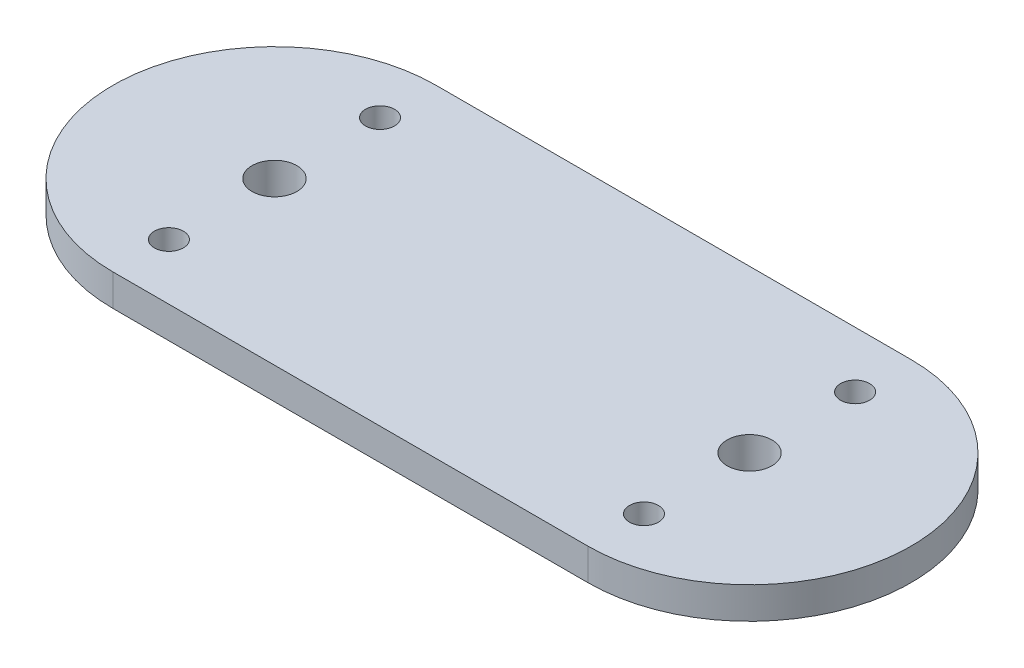
ISO-10303-21;
HEADER;
FILE_DESCRIPTION(('STEP AP214'),'2;1');
FILE_NAME('part.step','',(''),(''),'','','');
FILE_SCHEMA(('AUTOMOTIVE_DESIGN { 1 0 10303 214 1 1 1 1 }'));
ENDSEC;
DATA;
#1=APPLICATION_CONTEXT('core data for automotive mechanical design processes');
#2=APPLICATION_PROTOCOL_DEFINITION('international standard','automotive_design',2000,#1);
#3=PRODUCT_CONTEXT('',#1,'mechanical');
#4=PRODUCT('Part','Part','',(#3));
#5=PRODUCT_RELATED_PRODUCT_CATEGORY('part','',(#4));
#6=PRODUCT_DEFINITION_FORMATION('','',#4);
#7=PRODUCT_DEFINITION_CONTEXT('part definition',#1,'design');
#8=PRODUCT_DEFINITION('design','',#6,#7);
#9=PRODUCT_DEFINITION_SHAPE('','',#8);
#10=(LENGTH_UNIT() NAMED_UNIT(*) SI_UNIT(.MILLI.,.METRE.));
#11=(NAMED_UNIT(*) PLANE_ANGLE_UNIT() SI_UNIT($,.RADIAN.));
#12=(NAMED_UNIT(*) SI_UNIT($,.STERADIAN.) SOLID_ANGLE_UNIT());
#13=UNCERTAINTY_MEASURE_WITH_UNIT(LENGTH_MEASURE(1.E-05),#10,'distance_accuracy_value','');
#14=(GEOMETRIC_REPRESENTATION_CONTEXT(3) GLOBAL_UNCERTAINTY_ASSIGNED_CONTEXT((#13)) GLOBAL_UNIT_ASSIGNED_CONTEXT((#10,
#11,#12)) REPRESENTATION_CONTEXT('',''));
#15=CARTESIAN_POINT('',(0.,0.,0.));
#16=DIRECTION('',(0.,0.,1.));
#17=DIRECTION('',(1.,0.,0.));
#18=AXIS2_PLACEMENT_3D('',#15,#16,#17);
#19=CARTESIAN_POINT('',(-31.9723183391004,3.,15.30530954));
#20=DIRECTION('',(0.,-1.,0.));
#21=DIRECTION('',(0.,0.,-1.));
#22=AXIS2_PLACEMENT_3D('',#19,#20,#21);
#23=CYLINDRICAL_SURFACE('',#22,15.30530954);
#24=CARTESIAN_POINT('',(-31.9723183391004,0.,15.30530954));
#25=DIRECTION('',(0.,1.,0.));
#26=DIRECTION('',(0.,0.,-1.));
#27=AXIS2_PLACEMENT_3D('',#24,#25,#26);
#28=CIRCLE('',#27,15.30530954);
#29=CARTESIAN_POINT('',(-31.9723183391004,0.,0.));
#30=VERTEX_POINT('',#29);
#31=CARTESIAN_POINT('',(-31.9723183391004,0.,30.61061908));
#32=VERTEX_POINT('',#31);
#33=EDGE_CURVE('E99',#30,#32,#28,.T.);
#34=ORIENTED_EDGE('',*,*,#33,.T.);
#35=DIRECTION('',(0.,-1.,0.));
#36=VECTOR('',#35,1.);
#37=CARTESIAN_POINT('',(-31.9723183391004,3.,30.61061908));
#38=LINE('',#37,#36);
#39=CARTESIAN_POINT('',(-31.9723183391004,3.,30.61061908));
#40=VERTEX_POINT('',#39);
#41=EDGE_CURVE('E11',#40,#32,#38,.T.);
#42=ORIENTED_EDGE('',*,*,#41,.F.);
#43=CARTESIAN_POINT('',(-31.9723183391004,3.,15.30530954));
#44=DIRECTION('',(0.,1.,0.));
#45=DIRECTION('',(0.,0.,-1.));
#46=AXIS2_PLACEMENT_3D('',#43,#44,#45);
#47=CIRCLE('',#46,15.30530954);
#48=CARTESIAN_POINT('',(-31.9723183391004,3.,0.));
#49=VERTEX_POINT('',#48);
#50=EDGE_CURVE('E87',#49,#40,#47,.T.);
#51=ORIENTED_EDGE('',*,*,#50,.F.);
#52=DIRECTION('',(0.,-1.,0.));
#53=VECTOR('',#52,1.);
#54=CARTESIAN_POINT('',(-31.9723183391004,3.,0.));
#55=LINE('',#54,#53);
#56=EDGE_CURVE('E95',#49,#30,#55,.T.);
#57=ORIENTED_EDGE('',*,*,#56,.T.);
#58=EDGE_LOOP('',(#34,#42,#51,#57));
#59=FACE_BOUND('',#58,.T.);
#60=ADVANCED_FACE('F36',(#59),#23,.T.);
#61=CARTESIAN_POINT('',(13.0276816608996,3.,30.61061908));
#62=DIRECTION('',(0.,0.,-1.));
#63=DIRECTION('',(-1.,0.,0.));
#64=AXIS2_PLACEMENT_3D('',#61,#62,#63);
#65=PLANE('',#64);
#66=DIRECTION('',(1.,0.,0.));
#67=VECTOR('',#66,1.);
#68=CARTESIAN_POINT('',(13.0276816608996,0.,30.61061908));
#69=LINE('',#68,#67);
#70=CARTESIAN_POINT('',(13.0276816608996,0.,30.61061908));
#71=VERTEX_POINT('',#70);
#72=EDGE_CURVE('E91',#32,#71,#69,.T.);
#73=ORIENTED_EDGE('',*,*,#72,.T.);
#74=DIRECTION('',(0.,-1.,0.));
#75=VECTOR('',#74,1.);
#76=CARTESIAN_POINT('',(13.0276816608996,3.,30.61061908));
#77=LINE('',#76,#75);
#78=CARTESIAN_POINT('',(13.0276816608996,3.,30.61061908));
#79=VERTEX_POINT('',#78);
#80=EDGE_CURVE('E44',#79,#71,#77,.T.);
#81=ORIENTED_EDGE('',*,*,#80,.F.);
#82=DIRECTION('',(1.,0.,0.));
#83=VECTOR('',#82,1.);
#84=CARTESIAN_POINT('',(13.0276816608996,3.,30.61061908));
#85=LINE('',#84,#83);
#86=EDGE_CURVE('E82',#40,#79,#85,.T.);
#87=ORIENTED_EDGE('',*,*,#86,.F.);
#88=ORIENTED_EDGE('',*,*,#41,.T.);
#89=EDGE_LOOP('',(#73,#81,#87,#88));
#90=FACE_BOUND('',#89,.T.);
#91=ADVANCED_FACE('F90',(#90),#65,.F.);
#92=CARTESIAN_POINT('',(13.0276816608996,3.,15.30530954));
#93=DIRECTION('',(0.,-1.,0.));
#94=DIRECTION('',(0.,0.,-1.));
#95=AXIS2_PLACEMENT_3D('',#92,#93,#94);
#96=CYLINDRICAL_SURFACE('',#95,15.30530954);
#97=CARTESIAN_POINT('',(13.0276816608996,0.,15.30530954));
#98=DIRECTION('',(0.,1.,0.));
#99=DIRECTION('',(0.,0.,-1.));
#100=AXIS2_PLACEMENT_3D('',#97,#98,#99);
#101=CIRCLE('',#100,15.30530954);
#102=CARTESIAN_POINT('',(13.0276816608996,0.,0.));
#103=VERTEX_POINT('',#102);
#104=EDGE_CURVE('E69',#71,#103,#101,.T.);
#105=ORIENTED_EDGE('',*,*,#104,.T.);
#106=DIRECTION('',(0.,-1.,0.));
#107=VECTOR('',#106,1.);
#108=CARTESIAN_POINT('',(13.0276816608996,3.,0.));
#109=LINE('',#108,#107);
#110=CARTESIAN_POINT('',(13.0276816608996,3.,0.));
#111=VERTEX_POINT('',#110);
#112=EDGE_CURVE('E92',#111,#103,#109,.T.);
#113=ORIENTED_EDGE('',*,*,#112,.F.);
#114=CARTESIAN_POINT('',(13.0276816608996,3.,15.30530954));
#115=DIRECTION('',(0.,1.,0.));
#116=DIRECTION('',(0.,0.,-1.));
#117=AXIS2_PLACEMENT_3D('',#114,#115,#116);
#118=CIRCLE('',#117,15.30530954);
#119=EDGE_CURVE('E85',#79,#111,#118,.T.);
#120=ORIENTED_EDGE('',*,*,#119,.F.);
#121=ORIENTED_EDGE('',*,*,#80,.T.);
#122=EDGE_LOOP('',(#105,#113,#120,#121));
#123=FACE_BOUND('',#122,.T.);
#124=ADVANCED_FACE('F93',(#123),#96,.T.);
#125=CARTESIAN_POINT('',(-31.9723183391004,3.,0.));
#126=DIRECTION('',(0.,0.,1.));
#127=DIRECTION('',(1.,0.,0.));
#128=AXIS2_PLACEMENT_3D('',#125,#126,#127);
#129=PLANE('',#128);
#130=DIRECTION('',(-1.,0.,0.));
#131=VECTOR('',#130,1.);
#132=CARTESIAN_POINT('',(-31.9723183391004,0.,0.));
#133=LINE('',#132,#131);
#134=EDGE_CURVE('E75',#103,#30,#133,.T.);
#135=ORIENTED_EDGE('',*,*,#134,.T.);
#136=ORIENTED_EDGE('',*,*,#56,.F.);
#137=DIRECTION('',(-1.,0.,0.));
#138=VECTOR('',#137,1.);
#139=CARTESIAN_POINT('',(-31.9723183391004,3.,0.));
#140=LINE('',#139,#138);
#141=EDGE_CURVE('E52',#111,#49,#140,.T.);
#142=ORIENTED_EDGE('',*,*,#141,.F.);
#143=ORIENTED_EDGE('',*,*,#112,.T.);
#144=EDGE_LOOP('',(#135,#136,#142,#143));
#145=FACE_BOUND('',#144,.T.);
#146=ADVANCED_FACE('F107',(#145),#129,.F.);
#147=CARTESIAN_POINT('',(-31.9723183391004,3.,15.30530954));
#148=DIRECTION('',(0.,-1.,0.));
#149=DIRECTION('',(0.,0.,-1.));
#150=AXIS2_PLACEMENT_3D('',#147,#148,#149);
#151=PLANE('',#150);
#152=CARTESIAN_POINT('',(-31.9723183391004,3.,5.30530954));
#153=DIRECTION('',(0.,1.,0.));
#154=DIRECTION('',(0.,0.,1.));
#155=AXIS2_PLACEMENT_3D('',#152,#153,#154);
#156=CIRCLE('',#155,1.375);
#157=CARTESIAN_POINT('',(-31.9723183391004,3.,6.68030954));
#158=VERTEX_POINT('',#157);
#159=EDGE_CURVE('E138',#158,#158,#156,.T.);
#160=ORIENTED_EDGE('',*,*,#159,.F.);
#161=EDGE_LOOP('',(#160));
#162=FACE_BOUND('',#161,.T.);
#163=CARTESIAN_POINT('',(-31.9723183391004,3.,25.30530954));
#164=DIRECTION('',(0.,1.,0.));
#165=DIRECTION('',(0.,0.,-1.));
#166=AXIS2_PLACEMENT_3D('',#163,#164,#165);
#167=CIRCLE('',#166,1.375);
#168=CARTESIAN_POINT('',(-31.9723183391004,3.,23.93030954));
#169=VERTEX_POINT('',#168);
#170=EDGE_CURVE('E132',#169,#169,#167,.T.);
#171=ORIENTED_EDGE('',*,*,#170,.F.);
#172=EDGE_LOOP('',(#171));
#173=FACE_BOUND('',#172,.T.);
#174=CARTESIAN_POINT('',(13.0276816608996,3.,5.30530954));
#175=DIRECTION('',(0.,1.,0.));
#176=DIRECTION('',(0.,0.,-1.));
#177=AXIS2_PLACEMENT_3D('',#174,#175,#176);
#178=CIRCLE('',#177,1.375);
#179=CARTESIAN_POINT('',(13.0276816608996,3.,3.93030954));
#180=VERTEX_POINT('',#179);
#181=EDGE_CURVE('E126',#180,#180,#178,.T.);
#182=ORIENTED_EDGE('',*,*,#181,.F.);
#183=EDGE_LOOP('',(#182));
#184=FACE_BOUND('',#183,.T.);
#185=CARTESIAN_POINT('',(13.0276816608996,3.,15.30530954));
#186=DIRECTION('',(0.,1.,0.));
#187=DIRECTION('',(0.,0.,-1.));
#188=AXIS2_PLACEMENT_3D('',#185,#186,#187);
#189=CIRCLE('',#188,2.125);
#190=CARTESIAN_POINT('',(13.0276816608996,3.,13.18030954));
#191=VERTEX_POINT('',#190);
#192=EDGE_CURVE('E119',#191,#191,#189,.T.);
#193=ORIENTED_EDGE('',*,*,#192,.F.);
#194=EDGE_LOOP('',(#193));
#195=FACE_BOUND('',#194,.T.);
#196=CARTESIAN_POINT('',(13.0276816608996,3.,25.30530954));
#197=DIRECTION('',(0.,1.,0.));
#198=DIRECTION('',(0.,0.,1.));
#199=AXIS2_PLACEMENT_3D('',#196,#197,#198);
#200=CIRCLE('',#199,1.375);
#201=CARTESIAN_POINT('',(13.0276816608996,3.,26.68030954));
#202=VERTEX_POINT('',#201);
#203=EDGE_CURVE('E143',#202,#202,#200,.T.);
#204=ORIENTED_EDGE('',*,*,#203,.F.);
#205=EDGE_LOOP('',(#204));
#206=FACE_BOUND('',#205,.T.);
#207=CARTESIAN_POINT('',(-31.9723183391004,3.,15.30530954));
#208=DIRECTION('',(0.,1.,0.));
#209=DIRECTION('',(0.,0.,1.));
#210=AXIS2_PLACEMENT_3D('',#207,#208,#209);
#211=CIRCLE('',#210,2.125);
#212=CARTESIAN_POINT('',(-31.9723183391004,3.,17.43030954));
#213=VERTEX_POINT('',#212);
#214=EDGE_CURVE('E113',#213,#213,#211,.T.);
#215=ORIENTED_EDGE('',*,*,#214,.F.);
#216=EDGE_LOOP('',(#215));
#217=FACE_BOUND('',#216,.T.);
#218=ORIENTED_EDGE('',*,*,#50,.T.);
#219=ORIENTED_EDGE('',*,*,#86,.T.);
#220=ORIENTED_EDGE('',*,*,#119,.T.);
#221=ORIENTED_EDGE('',*,*,#141,.T.);
#222=EDGE_LOOP('',(#218,#219,#220,#221));
#223=FACE_BOUND('',#222,.T.);
#224=ADVANCED_FACE('F83',(#162,#173,#184,#195,#206,#217,#223),#151,.F.);
#225=CARTESIAN_POINT('',(-31.9723183391004,0.,15.30530954));
#226=DIRECTION('',(0.,-1.,0.));
#227=DIRECTION('',(0.,0.,-1.));
#228=AXIS2_PLACEMENT_3D('',#225,#226,#227);
#229=PLANE('',#228);
#230=CARTESIAN_POINT('',(-31.9723183391004,0.,5.30530954));
#231=DIRECTION('',(0.,1.,0.));
#232=DIRECTION('',(0.,0.,1.));
#233=AXIS2_PLACEMENT_3D('',#230,#231,#232);
#234=CIRCLE('',#233,1.375);
#235=CARTESIAN_POINT('',(-31.9723183391004,0.,6.68030954));
#236=VERTEX_POINT('',#235);
#237=EDGE_CURVE('E116',#236,#236,#234,.T.);
#238=ORIENTED_EDGE('',*,*,#237,.T.);
#239=EDGE_LOOP('',(#238));
#240=FACE_BOUND('',#239,.T.);
#241=CARTESIAN_POINT('',(-31.9723183391004,0.,25.30530954));
#242=DIRECTION('',(0.,1.,0.));
#243=DIRECTION('',(0.,0.,-1.));
#244=AXIS2_PLACEMENT_3D('',#241,#242,#243);
#245=CIRCLE('',#244,1.375);
#246=CARTESIAN_POINT('',(-31.9723183391004,0.,23.93030954));
#247=VERTEX_POINT('',#246);
#248=EDGE_CURVE('E135',#247,#247,#245,.T.);
#249=ORIENTED_EDGE('',*,*,#248,.T.);
#250=EDGE_LOOP('',(#249));
#251=FACE_BOUND('',#250,.T.);
#252=CARTESIAN_POINT('',(13.0276816608996,0.,5.30530954));
#253=DIRECTION('',(0.,1.,0.));
#254=DIRECTION('',(0.,0.,-1.));
#255=AXIS2_PLACEMENT_3D('',#252,#253,#254);
#256=CIRCLE('',#255,1.375);
#257=CARTESIAN_POINT('',(13.0276816608996,0.,3.93030954));
#258=VERTEX_POINT('',#257);
#259=EDGE_CURVE('E129',#258,#258,#256,.T.);
#260=ORIENTED_EDGE('',*,*,#259,.T.);
#261=EDGE_LOOP('',(#260));
#262=FACE_BOUND('',#261,.T.);
#263=CARTESIAN_POINT('',(13.0276816608996,0.,15.30530954));
#264=DIRECTION('',(0.,1.,0.));
#265=DIRECTION('',(0.,0.,-1.));
#266=AXIS2_PLACEMENT_3D('',#263,#264,#265);
#267=CIRCLE('',#266,2.125);
#268=CARTESIAN_POINT('',(13.0276816608996,0.,13.18030954));
#269=VERTEX_POINT('',#268);
#270=EDGE_CURVE('E122',#269,#269,#267,.T.);
#271=ORIENTED_EDGE('',*,*,#270,.T.);
#272=EDGE_LOOP('',(#271));
#273=FACE_BOUND('',#272,.T.);
#274=CARTESIAN_POINT('',(13.0276816608996,0.,25.30530954));
#275=DIRECTION('',(0.,1.,0.));
#276=DIRECTION('',(0.,0.,1.));
#277=AXIS2_PLACEMENT_3D('',#274,#275,#276);
#278=CIRCLE('',#277,1.375);
#279=CARTESIAN_POINT('',(13.0276816608996,0.,26.68030954));
#280=VERTEX_POINT('',#279);
#281=EDGE_CURVE('E123',#280,#280,#278,.T.);
#282=ORIENTED_EDGE('',*,*,#281,.T.);
#283=EDGE_LOOP('',(#282));
#284=FACE_BOUND('',#283,.T.);
#285=CARTESIAN_POINT('',(-31.9723183391004,0.,15.30530954));
#286=DIRECTION('',(0.,1.,0.));
#287=DIRECTION('',(0.,0.,1.));
#288=AXIS2_PLACEMENT_3D('',#285,#286,#287);
#289=CIRCLE('',#288,2.125);
#290=CARTESIAN_POINT('',(-31.9723183391004,0.,17.43030954));
#291=VERTEX_POINT('',#290);
#292=EDGE_CURVE('E102',#291,#291,#289,.T.);
#293=ORIENTED_EDGE('',*,*,#292,.T.);
#294=EDGE_LOOP('',(#293));
#295=FACE_BOUND('',#294,.T.);
#296=ORIENTED_EDGE('',*,*,#33,.F.);
#297=ORIENTED_EDGE('',*,*,#134,.F.);
#298=ORIENTED_EDGE('',*,*,#104,.F.);
#299=ORIENTED_EDGE('',*,*,#72,.F.);
#300=EDGE_LOOP('',(#296,#297,#298,#299));
#301=FACE_BOUND('',#300,.T.);
#302=ADVANCED_FACE('F110',(#240,#251,#262,#273,#284,#295,#301),#229,.T.);
#303=CARTESIAN_POINT('',(-31.9723183391004,0.,15.30530954));
#304=DIRECTION('',(0.,1.,0.));
#305=DIRECTION('',(0.,0.,1.));
#306=AXIS2_PLACEMENT_3D('',#303,#304,#305);
#307=CYLINDRICAL_SURFACE('',#306,2.125);
#308=ORIENTED_EDGE('',*,*,#292,.F.);
#309=EDGE_LOOP('',(#308));
#310=FACE_BOUND('',#309,.T.);
#311=ORIENTED_EDGE('',*,*,#214,.T.);
#312=EDGE_LOOP('',(#311));
#313=FACE_BOUND('',#312,.T.);
#314=ADVANCED_FACE('F155',(#310,#313),#307,.F.);
#315=CARTESIAN_POINT('',(13.0276816608996,0.,25.30530954));
#316=DIRECTION('',(0.,1.,0.));
#317=DIRECTION('',(0.,0.,1.));
#318=AXIS2_PLACEMENT_3D('',#315,#316,#317);
#319=CYLINDRICAL_SURFACE('',#318,1.375);
#320=ORIENTED_EDGE('',*,*,#281,.F.);
#321=EDGE_LOOP('',(#320));
#322=FACE_BOUND('',#321,.T.);
#323=ORIENTED_EDGE('',*,*,#203,.T.);
#324=EDGE_LOOP('',(#323));
#325=FACE_BOUND('',#324,.T.);
#326=ADVANCED_FACE('F151',(#322,#325),#319,.F.);
#327=CARTESIAN_POINT('',(13.0276816608996,0.,15.30530954));
#328=DIRECTION('',(0.,1.,0.));
#329=DIRECTION('',(0.,0.,1.));
#330=AXIS2_PLACEMENT_3D('',#327,#328,#329);
#331=CYLINDRICAL_SURFACE('',#330,2.125);
#332=ORIENTED_EDGE('',*,*,#270,.F.);
#333=EDGE_LOOP('',(#332));
#334=FACE_BOUND('',#333,.T.);
#335=ORIENTED_EDGE('',*,*,#192,.T.);
#336=EDGE_LOOP('',(#335));
#337=FACE_BOUND('',#336,.T.);
#338=ADVANCED_FACE('F154',(#334,#337),#331,.F.);
#339=CARTESIAN_POINT('',(13.0276816608996,0.,5.30530954));
#340=DIRECTION('',(0.,1.,0.));
#341=DIRECTION('',(0.,0.,1.));
#342=AXIS2_PLACEMENT_3D('',#339,#340,#341);
#343=CYLINDRICAL_SURFACE('',#342,1.375);
#344=ORIENTED_EDGE('',*,*,#259,.F.);
#345=EDGE_LOOP('',(#344));
#346=FACE_BOUND('',#345,.T.);
#347=ORIENTED_EDGE('',*,*,#181,.T.);
#348=EDGE_LOOP('',(#347));
#349=FACE_BOUND('',#348,.T.);
#350=ADVANCED_FACE('F216',(#346,#349),#343,.F.);
#351=CARTESIAN_POINT('',(-31.9723183391004,0.,25.30530954));
#352=DIRECTION('',(0.,1.,0.));
#353=DIRECTION('',(0.,0.,1.));
#354=AXIS2_PLACEMENT_3D('',#351,#352,#353);
#355=CYLINDRICAL_SURFACE('',#354,1.375);
#356=ORIENTED_EDGE('',*,*,#248,.F.);
#357=EDGE_LOOP('',(#356));
#358=FACE_BOUND('',#357,.T.);
#359=ORIENTED_EDGE('',*,*,#170,.T.);
#360=EDGE_LOOP('',(#359));
#361=FACE_BOUND('',#360,.T.);
#362=ADVANCED_FACE('F225',(#358,#361),#355,.F.);
#363=CARTESIAN_POINT('',(-31.9723183391004,0.,5.30530954));
#364=DIRECTION('',(0.,1.,0.));
#365=DIRECTION('',(0.,0.,1.));
#366=AXIS2_PLACEMENT_3D('',#363,#364,#365);
#367=CYLINDRICAL_SURFACE('',#366,1.375);
#368=ORIENTED_EDGE('',*,*,#237,.F.);
#369=EDGE_LOOP('',(#368));
#370=FACE_BOUND('',#369,.T.);
#371=ORIENTED_EDGE('',*,*,#159,.T.);
#372=EDGE_LOOP('',(#371));
#373=FACE_BOUND('',#372,.T.);
#374=ADVANCED_FACE('F235',(#370,#373),#367,.F.);
#375=CLOSED_SHELL('',(#60,#91,#124,#146,#224,#302,#314,#326,#338,#350,#362,#374));
#376=MANIFOLD_SOLID_BREP('B2',#375);
#377=ADVANCED_BREP_SHAPE_REPRESENTATION('',(#18,#376),#14);
#378=SHAPE_DEFINITION_REPRESENTATION(#9,#377);
ENDSEC;
END-ISO-10303-21;
